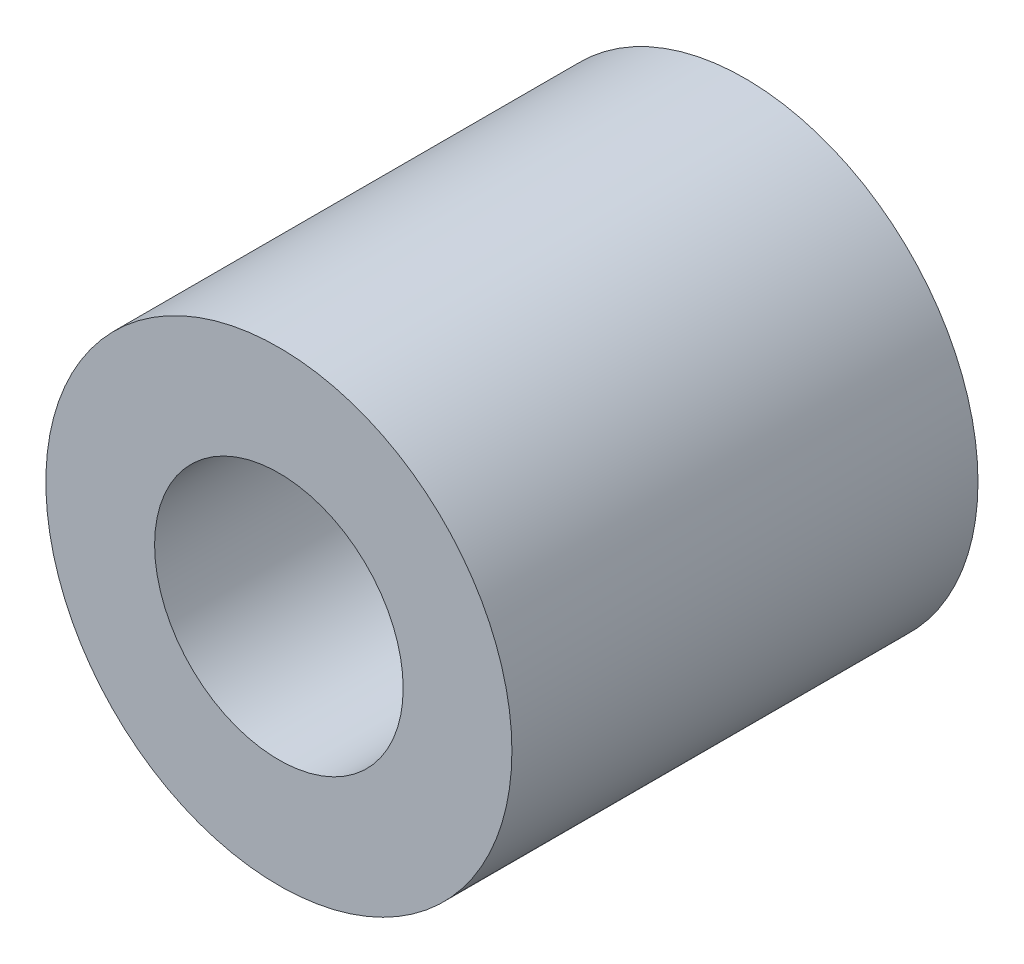
ISO-10303-21;
HEADER;
FILE_DESCRIPTION(('STEP AP214'),'2;1');
FILE_NAME('part.step','',(''),(''),'','','');
FILE_SCHEMA(('AUTOMOTIVE_DESIGN { 1 0 10303 214 1 1 1 1 }'));
ENDSEC;
DATA;
#1=APPLICATION_CONTEXT('core data for automotive mechanical design processes');
#2=APPLICATION_PROTOCOL_DEFINITION('international standard','automotive_design',2000,#1);
#3=PRODUCT_CONTEXT('',#1,'mechanical');
#4=PRODUCT('Part','Part','',(#3));
#5=PRODUCT_RELATED_PRODUCT_CATEGORY('part','',(#4));
#6=PRODUCT_DEFINITION_FORMATION('','',#4);
#7=PRODUCT_DEFINITION_CONTEXT('part definition',#1,'design');
#8=PRODUCT_DEFINITION('design','',#6,#7);
#9=PRODUCT_DEFINITION_SHAPE('','',#8);
#10=(LENGTH_UNIT() NAMED_UNIT(*) SI_UNIT(.MILLI.,.METRE.));
#11=(NAMED_UNIT(*) PLANE_ANGLE_UNIT() SI_UNIT($,.RADIAN.));
#12=(NAMED_UNIT(*) SI_UNIT($,.STERADIAN.) SOLID_ANGLE_UNIT());
#13=UNCERTAINTY_MEASURE_WITH_UNIT(LENGTH_MEASURE(1.E-05),#10,'distance_accuracy_value','');
#14=(GEOMETRIC_REPRESENTATION_CONTEXT(3) GLOBAL_UNCERTAINTY_ASSIGNED_CONTEXT((#13)) GLOBAL_UNIT_ASSIGNED_CONTEXT((#10,
#11,#12)) REPRESENTATION_CONTEXT('',''));
#15=CARTESIAN_POINT('',(0.,0.,0.));
#16=DIRECTION('',(0.,0.,1.));
#17=DIRECTION('',(1.,0.,0.));
#18=AXIS2_PLACEMENT_3D('',#15,#16,#17);
#19=CARTESIAN_POINT('',(0.,0.,6.));
#20=DIRECTION('',(0.,0.,1.));
#21=DIRECTION('',(1.,0.,0.));
#22=AXIS2_PLACEMENT_3D('',#19,#20,#21);
#23=PLANE('',#22);
#24=CARTESIAN_POINT('',(0.,0.,6.));
#25=DIRECTION('',(0.,0.,1.));
#26=DIRECTION('',(1.,0.,0.));
#27=AXIS2_PLACEMENT_3D('',#24,#25,#26);
#28=CIRCLE('',#27,3.);
#29=CARTESIAN_POINT('',(3.,0.,6.));
#30=VERTEX_POINT('',#29);
#31=EDGE_CURVE('E10',#30,#30,#28,.T.);
#32=ORIENTED_EDGE('',*,*,#31,.T.);
#33=EDGE_LOOP('',(#32));
#34=FACE_BOUND('',#33,.T.);
#35=CARTESIAN_POINT('',(0.,0.,6.));
#36=DIRECTION('',(0.,0.,1.));
#37=DIRECTION('',(1.,0.,0.));
#38=AXIS2_PLACEMENT_3D('',#35,#36,#37);
#39=CIRCLE('',#38,1.6);
#40=CARTESIAN_POINT('',(1.6,0.,6.));
#41=VERTEX_POINT('',#40);
#42=EDGE_CURVE('E42',#41,#41,#39,.T.);
#43=ORIENTED_EDGE('',*,*,#42,.F.);
#44=EDGE_LOOP('',(#43));
#45=FACE_BOUND('',#44,.T.);
#46=ADVANCED_FACE('F31',(#34,#45),#23,.T.);
#47=CARTESIAN_POINT('',(0.,0.,0.));
#48=DIRECTION('',(0.,0.,1.));
#49=DIRECTION('',(1.,0.,0.));
#50=AXIS2_PLACEMENT_3D('',#47,#48,#49);
#51=PLANE('',#50);
#52=CARTESIAN_POINT('',(0.,0.,0.));
#53=DIRECTION('',(0.,0.,1.));
#54=DIRECTION('',(1.,0.,0.));
#55=AXIS2_PLACEMENT_3D('',#52,#53,#54);
#56=CIRCLE('',#55,3.);
#57=CARTESIAN_POINT('',(3.,0.,0.));
#58=VERTEX_POINT('',#57);
#59=EDGE_CURVE('E35',#58,#58,#56,.T.);
#60=ORIENTED_EDGE('',*,*,#59,.F.);
#61=EDGE_LOOP('',(#60));
#62=FACE_BOUND('',#61,.T.);
#63=CARTESIAN_POINT('',(0.,0.,0.));
#64=DIRECTION('',(0.,0.,1.));
#65=DIRECTION('',(1.,0.,0.));
#66=AXIS2_PLACEMENT_3D('',#63,#64,#65);
#67=CIRCLE('',#66,1.6);
#68=CARTESIAN_POINT('',(1.6,0.,0.));
#69=VERTEX_POINT('',#68);
#70=EDGE_CURVE('E44',#69,#69,#67,.T.);
#71=ORIENTED_EDGE('',*,*,#70,.T.);
#72=EDGE_LOOP('',(#71));
#73=FACE_BOUND('',#72,.T.);
#74=ADVANCED_FACE('F54',(#62,#73),#51,.F.);
#75=CARTESIAN_POINT('',(0.,0.,6.));
#76=DIRECTION('',(0.,0.,-1.));
#77=DIRECTION('',(-1.,0.,0.));
#78=AXIS2_PLACEMENT_3D('',#75,#76,#77);
#79=CYLINDRICAL_SURFACE('',#78,3.);
#80=ORIENTED_EDGE('',*,*,#31,.F.);
#81=EDGE_LOOP('',(#80));
#82=FACE_BOUND('',#81,.T.);
#83=ORIENTED_EDGE('',*,*,#59,.T.);
#84=EDGE_LOOP('',(#83));
#85=FACE_BOUND('',#84,.T.);
#86=ADVANCED_FACE('F33',(#82,#85),#79,.T.);
#87=CARTESIAN_POINT('',(0.,0.,6.));
#88=DIRECTION('',(0.,0.,-1.));
#89=DIRECTION('',(-1.,0.,0.));
#90=AXIS2_PLACEMENT_3D('',#87,#88,#89);
#91=CYLINDRICAL_SURFACE('',#90,1.6);
#92=ORIENTED_EDGE('',*,*,#42,.T.);
#93=EDGE_LOOP('',(#92));
#94=FACE_BOUND('',#93,.T.);
#95=ORIENTED_EDGE('',*,*,#70,.F.);
#96=EDGE_LOOP('',(#95));
#97=FACE_BOUND('',#96,.T.);
#98=ADVANCED_FACE('F50',(#94,#97),#91,.F.);
#99=CLOSED_SHELL('',(#46,#74,#86,#98));
#100=MANIFOLD_SOLID_BREP('B2',#99);
#101=ADVANCED_BREP_SHAPE_REPRESENTATION('',(#18,#100),#14);
#102=SHAPE_DEFINITION_REPRESENTATION(#9,#101);
ENDSEC;
END-ISO-10303-21;
